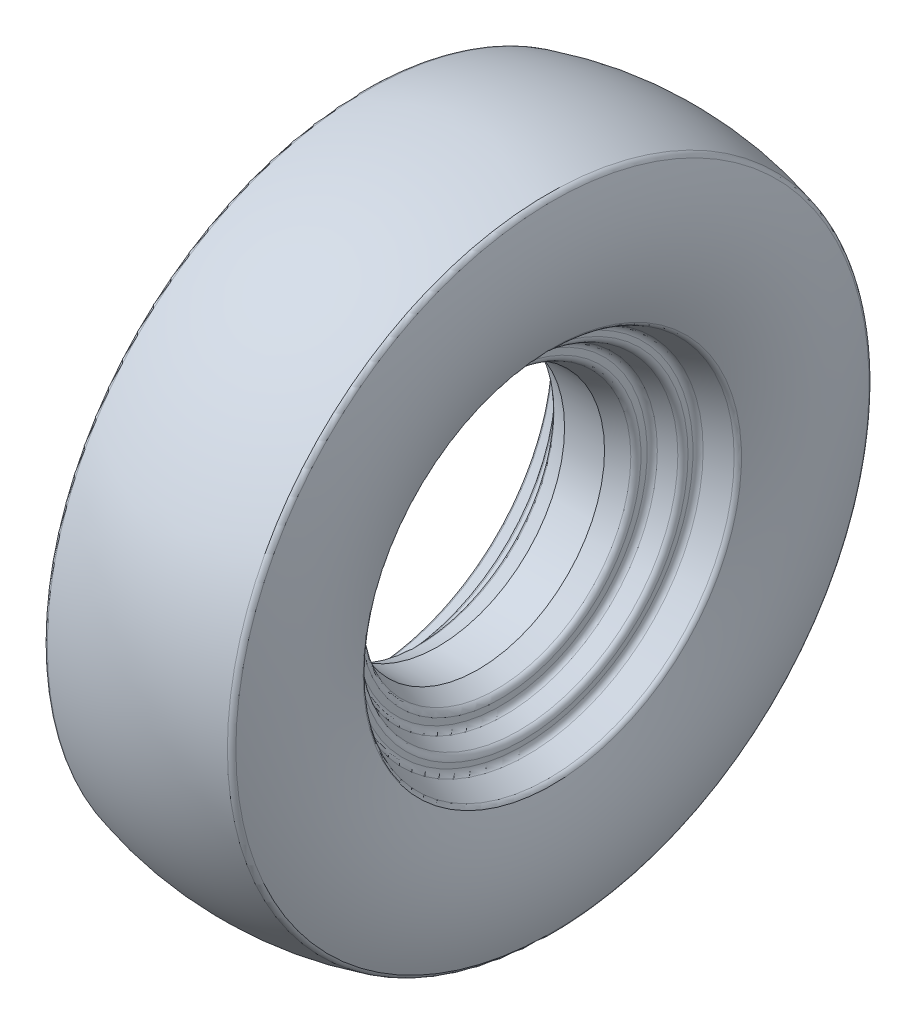
ISO-10303-21;
HEADER;
FILE_DESCRIPTION(('STEP AP214'),'2;1');
FILE_NAME('part.step','',(''),(''),'','','');
FILE_SCHEMA(('AUTOMOTIVE_DESIGN { 1 0 10303 214 1 1 1 1 }'));
ENDSEC;
DATA;
#1=APPLICATION_CONTEXT('core data for automotive mechanical design processes');
#2=APPLICATION_PROTOCOL_DEFINITION('international standard','automotive_design',2000,#1);
#3=PRODUCT_CONTEXT('',#1,'mechanical');
#4=PRODUCT('Part','Part','',(#3));
#5=PRODUCT_RELATED_PRODUCT_CATEGORY('part','',(#4));
#6=PRODUCT_DEFINITION_FORMATION('','',#4);
#7=PRODUCT_DEFINITION_CONTEXT('part definition',#1,'design');
#8=PRODUCT_DEFINITION('design','',#6,#7);
#9=PRODUCT_DEFINITION_SHAPE('','',#8);
#10=(LENGTH_UNIT() NAMED_UNIT(*) SI_UNIT(.MILLI.,.METRE.));
#11=(NAMED_UNIT(*) PLANE_ANGLE_UNIT() SI_UNIT($,.RADIAN.));
#12=(NAMED_UNIT(*) SI_UNIT($,.STERADIAN.) SOLID_ANGLE_UNIT());
#13=UNCERTAINTY_MEASURE_WITH_UNIT(LENGTH_MEASURE(1.E-05),#10,'distance_accuracy_value','');
#14=(GEOMETRIC_REPRESENTATION_CONTEXT(3) GLOBAL_UNCERTAINTY_ASSIGNED_CONTEXT((#13)) GLOBAL_UNIT_ASSIGNED_CONTEXT((#10,
#11,#12)) REPRESENTATION_CONTEXT('',''));
#15=CARTESIAN_POINT('',(0.,0.,0.));
#16=DIRECTION('',(0.,0.,1.));
#17=DIRECTION('',(1.,0.,0.));
#18=AXIS2_PLACEMENT_3D('',#15,#16,#17);
#19=CARTESIAN_POINT('',(0.,0.,0.));
#20=DIRECTION('',(-1.,0.,0.));
#21=DIRECTION('',(0.,0.,-1.));
#22=AXIS2_PLACEMENT_3D('',#19,#20,#21);
#23=SPHERICAL_SURFACE('',#22,250.);
#24=CARTESIAN_POINT('',(67.5948255435348,0.,0.));
#25=DIRECTION('',(-1.,0.,0.));
#26=DIRECTION('',(0.,0.,1.));
#27=AXIS2_PLACEMENT_3D('',#24,#25,#26);
#28=CIRCLE('',#27,240.688469935182);
#29=CARTESIAN_POINT('',(67.5948255435348,0.,-240.688469935182));
#30=VERTEX_POINT('',#29);
#31=EDGE_CURVE('E73',#30,#30,#28,.T.);
#32=CARTESIAN_POINT('',(-67.5948255435348,0.,0.));
#33=DIRECTION('',(-1.,0.,0.));
#34=DIRECTION('',(0.,0.,1.));
#35=AXIS2_PLACEMENT_3D('',#32,#33,#34);
#36=CIRCLE('',#35,240.688469935182);
#37=CARTESIAN_POINT('',(-67.5948255435348,0.,-240.688469935182));
#38=VERTEX_POINT('',#37);
#39=EDGE_CURVE('E252',#38,#38,#36,.T.);
#40=CARTESIAN_POINT('',(67.5948255435348,0.,-240.688469935182));
#41=CARTESIAN_POINT('',(66.2219639795535,0.,-241.074024999859));
#42=CARTESIAN_POINT('',(64.8458030328671,0.,-241.447831637435));
#43=CARTESIAN_POINT('',(62.0872867481365,0.,-242.171844056853));
#44=CARTESIAN_POINT('',(60.7049314100924,0.,-242.522049838696));
#45=CARTESIAN_POINT('',(57.9344307166992,0.,-243.198756545124));
#46=CARTESIAN_POINT('',(56.5462853613501,0.,-243.525257469708));
#47=CARTESIAN_POINT('',(53.7646111887208,0.,-244.154459252569));
#48=CARTESIAN_POINT('',(52.3710823714405,0.,-244.457160110846));
#49=CARTESIAN_POINT('',(49.5790492763945,0.,-245.038673024625));
#50=CARTESIAN_POINT('',(48.1805449986288,0.,-245.317485080127));
#51=CARTESIAN_POINT('',(45.378970475778,0.,-245.851138779535));
#52=CARTESIAN_POINT('',(43.975900230693,0.,-246.10598042344));
#53=CARTESIAN_POINT('',(41.1656045939478,0.,-246.591618673811));
#54=CARTESIAN_POINT('',(39.7583792022877,0.,-246.822415280277));
#55=CARTESIAN_POINT('',(36.9401853122799,0.,-247.259895879923));
#56=CARTESIAN_POINT('',(35.5292168139322,0.,-247.466579873103));
#57=CARTESIAN_POINT('',(32.7039498457569,0.,-247.85577472801));
#58=CARTESIAN_POINT('',(31.2896513759294,0.,-248.038285589738));
#59=CARTESIAN_POINT('',(28.4581385752068,0.,-248.379080742217));
#60=CARTESIAN_POINT('',(27.0409242443117,0.,-248.537365032969));
#61=CARTESIAN_POINT('',(24.2039946855899,0.,-248.829660697394));
#62=CARTESIAN_POINT('',(22.7842794577633,0.,-248.963672071067));
#63=CARTESIAN_POINT('',(19.9427638015965,0.,-249.207382662458));
#64=CARTESIAN_POINT('',(18.5209633732564,0.,-249.317081880174));
#65=CARTESIAN_POINT('',(15.6756936230299,0.,-249.512136039424));
#66=CARTESIAN_POINT('',(14.2522243011435,0.,-249.597490980957));
#67=CARTESIAN_POINT('',(11.4040335594486,0.,-249.743831595685));
#68=CARTESIAN_POINT('',(9.97931213964019,0.,-249.804817268881));
#69=CARTESIAN_POINT('',(7.12903436434326,0.,-249.902401490164));
#70=CARTESIAN_POINT('',(5.70347800885472,0.,-249.939000038253));
#71=CARTESIAN_POINT('',(2.85194776891079,0.,-249.987799293171));
#72=CARTESIAN_POINT('',(1.4259738844554,0.,-250.));
#73=CARTESIAN_POINT('',(-1.42597388445538,0.,-250.));
#74=CARTESIAN_POINT('',(-2.85194776891077,0.,-249.987799293171));
#75=CARTESIAN_POINT('',(-5.70347800885469,0.,-249.939000038253));
#76=CARTESIAN_POINT('',(-7.12903436434323,0.,-249.902401490164));
#77=CARTESIAN_POINT('',(-9.97931213964016,0.,-249.804817268881));
#78=CARTESIAN_POINT('',(-11.4040335594486,0.,-249.743831595685));
#79=CARTESIAN_POINT('',(-14.2522243011434,0.,-249.597490980957));
#80=CARTESIAN_POINT('',(-15.6756936230299,0.,-249.512136039424));
#81=CARTESIAN_POINT('',(-18.5209633732564,0.,-249.317081880174));
#82=CARTESIAN_POINT('',(-19.9427638015965,0.,-249.207382662458));
#83=CARTESIAN_POINT('',(-22.7842794577632,0.,-248.963672071067));
#84=CARTESIAN_POINT('',(-24.2039946855899,0.,-248.829660697394));
#85=CARTESIAN_POINT('',(-27.0409242443117,0.,-248.537365032969));
#86=CARTESIAN_POINT('',(-28.4581385752068,0.,-248.379080742217));
#87=CARTESIAN_POINT('',(-31.2896513759294,0.,-248.038285589738));
#88=CARTESIAN_POINT('',(-32.7039498457569,0.,-247.85577472801));
#89=CARTESIAN_POINT('',(-35.5292168139321,0.,-247.466579873103));
#90=CARTESIAN_POINT('',(-36.9401853122799,0.,-247.259895879923));
#91=CARTESIAN_POINT('',(-39.7583792022877,0.,-246.822415280277));
#92=CARTESIAN_POINT('',(-41.1656045939478,0.,-246.591618673811));
#93=CARTESIAN_POINT('',(-43.975900230693,0.,-246.10598042344));
#94=CARTESIAN_POINT('',(-45.378970475778,0.,-245.851138779535));
#95=CARTESIAN_POINT('',(-48.1805449986288,0.,-245.317485080127));
#96=CARTESIAN_POINT('',(-49.5790492763945,0.,-245.038673024625));
#97=CARTESIAN_POINT('',(-52.3710823714405,0.,-244.457160110846));
#98=CARTESIAN_POINT('',(-53.7646111887207,0.,-244.154459252569));
#99=CARTESIAN_POINT('',(-56.5462853613501,0.,-243.525257469708));
#100=CARTESIAN_POINT('',(-57.9344307166992,0.,-243.198756545124));
#101=CARTESIAN_POINT('',(-60.7049314100924,0.,-242.522049838696));
#102=CARTESIAN_POINT('',(-62.0872867481365,0.,-242.171844056853));
#103=CARTESIAN_POINT('',(-64.845803032867,0.,-241.447831637435));
#104=CARTESIAN_POINT('',(-66.2219639795535,0.,-241.074024999859));
#105=CARTESIAN_POINT('',(-67.5948255435348,0.,-240.688469935182));
#106=B_SPLINE_CURVE_WITH_KNOTS('',3,(#40,#41,#42,#43,#44,#45,#46,#47,#48,#49,#50,#51,#52,#53,
#54,#55,#56,#57,#58,#59,#60,#61,#62,#63,#64,#65,#66,#67,#68,#69,#70,#71,#72,#73,#74,#75,#76,#77,
#78,#79,#80,#81,#82,#83,#84,#85,#86,#87,#88,#89,#90,#91,#92,#93,#94,#95,#96,#97,#98,#99,#100,
#101,#102,#103,#104,#105),.UNSPECIFIED.,.F.,.F.,(4,2,2,2,2,2,2,2,2,2,2,2,2,2,2,2,2,2,2,2,2,2,2,
2,2,2,2,2,2,2,2,2,4),(0.,4.27786946320053,8.55573892640107,12.8336083896016,17.1114778528021,
21.3893473160027,25.6672167792032,29.9450862424037,34.2229557056042,38.5008251688048,
42.7786946320053,47.0565640952058,51.3344335584064,55.6123030216069,59.8901724848074,
64.168041948008,68.4459114112085,72.723780874409,77.0016503376095,81.2795198008101,
85.5573892640106,89.8352587272111,94.1131281904117,98.3909976536122,102.668867116813,
106.946736580013,111.224606043214,115.502475506414,119.780344969615,124.058214432815,
128.336083896016,132.613953359216,136.891822822417),.UNSPECIFIED.);
#107=EDGE_CURVE('BSEAM49',#30,#38,#106,.T.);
#108=ORIENTED_EDGE('',*,*,#31,.T.);
#109=ORIENTED_EDGE('',*,*,#39,.F.);
#110=ORIENTED_EDGE('',*,*,#107,.T.);
#111=ORIENTED_EDGE('',*,*,#107,.F.);
#112=EDGE_LOOP('',(#108,#110,#109,#111));
#113=FACE_BOUND('',#112,.T.);
#114=ADVANCED_FACE('F49',(#113),#23,.T.);
#115=CARTESIAN_POINT('',(70.0399463696018,0.,-140.));
#116=CARTESIAN_POINT('',(89.9800238695371,0.,-190.007667826586));
#117=CARTESIAN_POINT('',(70.,0.,-240.));
#118=B_SPLINE_CURVE_WITH_KNOTS('',2,(#115,#116,#117),.UNSPECIFIED.,.F.,.F.,(3,3),(0.,1.),.UNSPECIFIED.);
#119=CARTESIAN_POINT('',(-111.970451677944,0.,0.));
#120=DIRECTION('',(-1.,0.,0.));
#121=AXIS1_PLACEMENT('',#119,#120);
#122=SURFACE_OF_REVOLUTION('',#118,#121);
#123=CARTESIAN_POINT('',(70.8175545073131,0.,0.));
#124=DIRECTION('',(-1.,0.,0.));
#125=DIRECTION('',(0.,0.,1.));
#126=AXIS2_PLACEMENT_3D('',#123,#124,#125);
#127=CIRCLE('',#126,141.989781455221);
#128=CARTESIAN_POINT('',(70.8175545073131,0.,141.989781455221));
#129=VERTEX_POINT('',#128);
#130=EDGE_CURVE('E81',#129,#129,#127,.T.);
#131=ORIENTED_EDGE('',*,*,#130,.T.);
#132=EDGE_LOOP('',(#131));
#133=FACE_BOUND('',#132,.T.);
#134=CARTESIAN_POINT('',(70.9154064873113,0.,0.));
#135=DIRECTION('',(-1.,0.,0.));
#136=DIRECTION('',(0.,0.,1.));
#137=AXIS2_PLACEMENT_3D('',#134,#135,#136);
#138=CIRCLE('',#137,237.654575373599);
#139=CARTESIAN_POINT('',(70.9154064873113,0.,237.654575373599));
#140=VERTEX_POINT('',#139);
#141=EDGE_CURVE('E85',#140,#140,#138,.F.);
#142=ORIENTED_EDGE('',*,*,#141,.T.);
#143=EDGE_LOOP('',(#142));
#144=FACE_BOUND('',#143,.T.);
#145=ADVANCED_FACE('F119',(#133,#144),#122,.T.);
#146=CARTESIAN_POINT('',(48.7376188481971,0.,0.));
#147=DIRECTION('',(1.,0.,0.));
#148=DIRECTION('',(0.,0.,-1.));
#149=AXIS2_PLACEMENT_3D('',#146,#147,#148);
#150=CONICAL_SURFACE('',#149,130.932753785375,0.402417517667306);
#151=CARTESIAN_POINT('',(51.7793994311506,0.,0.));
#152=DIRECTION('',(1.,0.,0.));
#153=DIRECTION('',(0.,0.,-1.));
#154=AXIS2_PLACEMENT_3D('',#151,#152,#153);
#155=CIRCLE('',#154,132.227474911449);
#156=CARTESIAN_POINT('',(51.7793994311506,0.,-132.227474911449));
#157=VERTEX_POINT('',#156);
#158=EDGE_CURVE('E57',#157,#157,#155,.F.);
#159=ORIENTED_EDGE('',*,*,#158,.T.);
#160=EDGE_LOOP('',(#159));
#161=FACE_BOUND('',#160,.T.);
#162=CARTESIAN_POINT('',(68.1063067556766,0.,0.));
#163=DIRECTION('',(-1.,0.,0.));
#164=DIRECTION('',(0.,0.,1.));
#165=AXIS2_PLACEMENT_3D('',#162,#163,#164);
#166=CIRCLE('',#165,139.176954421896);
#167=CARTESIAN_POINT('',(68.1063067556766,0.,139.176954421896));
#168=VERTEX_POINT('',#167);
#169=EDGE_CURVE('E77',#168,#168,#166,.F.);
#170=ORIENTED_EDGE('',*,*,#169,.T.);
#171=EDGE_LOOP('',(#170));
#172=FACE_BOUND('',#171,.T.);
#173=ADVANCED_FACE('F123',(#161,#172),#150,.F.);
#174=CARTESIAN_POINT('',(48.737618848197,0.,-120.610275725007));
#175=DIRECTION('',(-1.,0.,0.));
#176=DIRECTION('',(0.,0.,1.));
#177=AXIS2_PLACEMENT_3D('',#174,#175,#176);
#178=PLANE('',#177);
#179=CARTESIAN_POINT('',(48.737618848197,0.,0.));
#180=DIRECTION('',(-1.,0.,0.));
#181=DIRECTION('',(0.,0.,1.));
#182=AXIS2_PLACEMENT_3D('',#179,#180,#181);
#183=CIRCLE('',#182,127.626890523058);
#184=CARTESIAN_POINT('',(48.737618848197,0.,127.626890523058));
#185=VERTEX_POINT('',#184);
#186=EDGE_CURVE('E10',#185,#185,#183,.F.);
#187=ORIENTED_EDGE('',*,*,#186,.T.);
#188=EDGE_LOOP('',(#187));
#189=FACE_BOUND('',#188,.T.);
#190=CARTESIAN_POINT('',(48.737618848197,0.,0.));
#191=DIRECTION('',(-1.,0.,0.));
#192=DIRECTION('',(0.,0.,1.));
#193=AXIS2_PLACEMENT_3D('',#190,#191,#192);
#194=CIRCLE('',#193,123.916138987324);
#195=CARTESIAN_POINT('',(48.737618848197,0.,123.916138987324));
#196=VERTEX_POINT('',#195);
#197=EDGE_CURVE('E93',#196,#196,#194,.T.);
#198=ORIENTED_EDGE('',*,*,#197,.T.);
#199=EDGE_LOOP('',(#198));
#200=FACE_BOUND('',#199,.T.);
#201=ADVANCED_FACE('F161',(#189,#200),#178,.F.);
#202=CARTESIAN_POINT('',(31.8688094240985,0.,0.));
#203=DIRECTION('',(1.,0.,0.));
#204=DIRECTION('',(0.,0.,-1.));
#205=AXIS2_PLACEMENT_3D('',#202,#203,#204);
#206=CONICAL_SURFACE('',#205,113.430137862503,0.402417517667305);
#207=CARTESIAN_POINT('',(34.9105900070521,0.,0.));
#208=DIRECTION('',(1.,0.,0.));
#209=DIRECTION('',(0.,0.,-1.));
#210=AXIS2_PLACEMENT_3D('',#207,#208,#209);
#211=CIRCLE('',#210,114.724858988577);
#212=CARTESIAN_POINT('',(34.9105900070521,0.,-114.724858988577));
#213=VERTEX_POINT('',#212);
#214=EDGE_CURVE('E67',#213,#213,#211,.F.);
#215=ORIENTED_EDGE('',*,*,#214,.T.);
#216=EDGE_LOOP('',(#215));
#217=FACE_BOUND('',#216,.T.);
#218=CARTESIAN_POINT('',(45.6958382652435,0.,0.));
#219=DIRECTION('',(-1.,0.,0.));
#220=DIRECTION('',(0.,0.,1.));
#221=AXIS2_PLACEMENT_3D('',#218,#219,#220);
#222=CIRCLE('',#221,119.315554598933);
#223=CARTESIAN_POINT('',(45.6958382652435,0.,119.315554598933));
#224=VERTEX_POINT('',#223);
#225=EDGE_CURVE('E89',#224,#224,#222,.F.);
#226=ORIENTED_EDGE('',*,*,#225,.T.);
#227=EDGE_LOOP('',(#226));
#228=FACE_BOUND('',#227,.T.);
#229=ADVANCED_FACE('F157',(#217,#228),#206,.F.);
#230=CARTESIAN_POINT('',(31.8688094240985,0.,-102.180137862503));
#231=DIRECTION('',(-1.,0.,0.));
#232=DIRECTION('',(0.,0.,1.));
#233=AXIS2_PLACEMENT_3D('',#230,#231,#232);
#234=PLANE('',#233);
#235=CARTESIAN_POINT('',(31.8688094240985,0.,0.));
#236=DIRECTION('',(-1.,0.,0.));
#237=DIRECTION('',(0.,0.,1.));
#238=AXIS2_PLACEMENT_3D('',#235,#236,#237);
#239=CIRCLE('',#238,110.124274600187);
#240=CARTESIAN_POINT('',(31.8688094240985,0.,110.124274600187));
#241=VERTEX_POINT('',#240);
#242=EDGE_CURVE('E62',#241,#241,#239,.F.);
#243=ORIENTED_EDGE('',*,*,#242,.T.);
#244=EDGE_LOOP('',(#243));
#245=FACE_BOUND('',#244,.T.);
#246=CARTESIAN_POINT('',(31.8688094240985,0.,0.));
#247=DIRECTION('',(-1.,0.,0.));
#248=DIRECTION('',(0.,0.,1.));
#249=AXIS2_PLACEMENT_3D('',#246,#247,#248);
#250=CIRCLE('',#249,105.48600112482);
#251=CARTESIAN_POINT('',(31.8688094240985,0.,105.48600112482));
#252=VERTEX_POINT('',#251);
#253=EDGE_CURVE('E101',#252,#252,#250,.T.);
#254=ORIENTED_EDGE('',*,*,#253,.T.);
#255=EDGE_LOOP('',(#254));
#256=FACE_BOUND('',#255,.T.);
#257=ADVANCED_FACE('F160',(#245,#256),#234,.F.);
#258=CARTESIAN_POINT('',(15.,0.,0.));
#259=DIRECTION('',(1.,0.,0.));
#260=DIRECTION('',(0.,0.,-1.));
#261=AXIS2_PLACEMENT_3D('',#258,#259,#260);
#262=CONICAL_SURFACE('',#261,95.,0.402417517667305);
#263=CARTESIAN_POINT('',(28.8270288411449,0.,0.));
#264=DIRECTION('',(-1.,0.,0.));
#265=DIRECTION('',(0.,0.,1.));
#266=AXIS2_PLACEMENT_3D('',#263,#264,#265);
#267=CIRCLE('',#266,100.88541673643);
#268=CARTESIAN_POINT('',(28.8270288411449,0.,100.88541673643));
#269=VERTEX_POINT('',#268);
#270=EDGE_CURVE('E97',#269,#269,#267,.F.);
#271=ORIENTED_EDGE('',*,*,#270,.T.);
#272=EDGE_LOOP('',(#271));
#273=FACE_BOUND('',#272,.T.);
#274=CARTESIAN_POINT('',(15.,0.,0.));
#275=DIRECTION('',(-1.,0.,0.));
#276=DIRECTION('',(0.,0.,1.));
#277=AXIS2_PLACEMENT_3D('',#274,#275,#276);
#278=CIRCLE('',#277,95.);
#279=CARTESIAN_POINT('',(15.,0.,95.));
#280=VERTEX_POINT('',#279);
#281=EDGE_CURVE('E105',#280,#280,#278,.T.);
#282=ORIENTED_EDGE('',*,*,#281,.T.);
#283=EDGE_LOOP('',(#282));
#284=FACE_BOUND('',#283,.T.);
#285=ADVANCED_FACE('F174',(#273,#284),#262,.F.);
#286=CARTESIAN_POINT('',(-111.970451677944,0.,0.));
#287=DIRECTION('',(-1.,0.,0.));
#288=DIRECTION('',(0.,0.,1.));
#289=AXIS2_PLACEMENT_3D('',#286,#287,#288);
#290=CYLINDRICAL_SURFACE('',#289,95.);
#291=ORIENTED_EDGE('',*,*,#281,.F.);
#292=EDGE_LOOP('',(#291));
#293=FACE_BOUND('',#292,.T.);
#294=CARTESIAN_POINT('',(-15.,0.,0.));
#295=DIRECTION('',(-1.,0.,0.));
#296=DIRECTION('',(0.,0.,1.));
#297=AXIS2_PLACEMENT_3D('',#294,#295,#296);
#298=CIRCLE('',#297,95.);
#299=CARTESIAN_POINT('',(-15.,0.,95.));
#300=VERTEX_POINT('',#299);
#301=EDGE_CURVE('E217',#300,#300,#298,.T.);
#302=ORIENTED_EDGE('',*,*,#301,.T.);
#303=EDGE_LOOP('',(#302));
#304=FACE_BOUND('',#303,.T.);
#305=ADVANCED_FACE('F133',(#293,#304),#290,.F.);
#306=CARTESIAN_POINT('',(26.8688094240985,0.,0.));
#307=DIRECTION('',(-1.,0.,0.));
#308=DIRECTION('',(0.,0.,1.));
#309=AXIS2_PLACEMENT_3D('',#306,#307,#308);
#310=TOROIDAL_SURFACE('',#309,105.48600112482,5.);
#311=ORIENTED_EDGE('',*,*,#270,.F.);
#312=EDGE_LOOP('',(#311));
#313=FACE_BOUND('',#312,.T.);
#314=ORIENTED_EDGE('',*,*,#253,.F.);
#315=EDGE_LOOP('',(#314));
#316=FACE_BOUND('',#315,.T.);
#317=ADVANCED_FACE('F129',(#313,#316),#310,.T.);
#318=CARTESIAN_POINT('',(43.737618848197,0.,0.));
#319=DIRECTION('',(-1.,0.,0.));
#320=DIRECTION('',(0.,0.,1.));
#321=AXIS2_PLACEMENT_3D('',#318,#319,#320);
#322=TOROIDAL_SURFACE('',#321,123.916138987324,5.);
#323=ORIENTED_EDGE('',*,*,#225,.F.);
#324=EDGE_LOOP('',(#323));
#325=FACE_BOUND('',#324,.T.);
#326=ORIENTED_EDGE('',*,*,#197,.F.);
#327=EDGE_LOOP('',(#326));
#328=FACE_BOUND('',#327,.T.);
#329=ADVANCED_FACE('F132',(#325,#328),#322,.T.);
#330=CARTESIAN_POINT('',(66.1480873386302,0.,0.));
#331=DIRECTION('',(1.,0.,0.));
#332=DIRECTION('',(0.,0.,-1.));
#333=AXIS2_PLACEMENT_3D('',#330,#331,#332);
#334=TOROIDAL_SURFACE('',#333,143.777538810287,5.);
#335=ORIENTED_EDGE('',*,*,#169,.F.);
#336=EDGE_LOOP('',(#335));
#337=FACE_BOUND('',#336,.T.);
#338=ORIENTED_EDGE('',*,*,#130,.F.);
#339=EDGE_LOOP('',(#338));
#340=FACE_BOUND('',#339,.T.);
#341=ADVANCED_FACE('F137',(#337,#340),#334,.T.);
#342=CARTESIAN_POINT('',(66.2429290326641,0.,0.));
#343=DIRECTION('',(-1.,0.,0.));
#344=DIRECTION('',(0.,0.,1.));
#345=AXIS2_PLACEMENT_3D('',#342,#343,#344);
#346=TOROIDAL_SURFACE('',#345,235.874700536479,5.);
#347=ORIENTED_EDGE('',*,*,#141,.F.);
#348=EDGE_LOOP('',(#347));
#349=FACE_BOUND('',#348,.T.);
#350=ORIENTED_EDGE('',*,*,#31,.F.);
#351=EDGE_LOOP('',(#350));
#352=FACE_BOUND('',#351,.T.);
#353=ADVANCED_FACE('F141',(#349,#352),#346,.T.);
#354=CARTESIAN_POINT('',(36.8688094240985,0.,0.));
#355=DIRECTION('',(-1.,0.,0.));
#356=DIRECTION('',(0.,0.,1.));
#357=AXIS2_PLACEMENT_3D('',#354,#355,#356);
#358=TOROIDAL_SURFACE('',#357,110.124274600187,5.);
#359=ORIENTED_EDGE('',*,*,#242,.F.);
#360=EDGE_LOOP('',(#359));
#361=FACE_BOUND('',#360,.T.);
#362=ORIENTED_EDGE('',*,*,#214,.F.);
#363=EDGE_LOOP('',(#362));
#364=FACE_BOUND('',#363,.T.);
#365=ADVANCED_FACE('F144',(#361,#364),#358,.F.);
#366=CARTESIAN_POINT('',(53.737618848197,0.,0.));
#367=DIRECTION('',(-1.,0.,0.));
#368=DIRECTION('',(0.,0.,1.));
#369=AXIS2_PLACEMENT_3D('',#366,#367,#368);
#370=TOROIDAL_SURFACE('',#369,127.626890523058,5.);
#371=ORIENTED_EDGE('',*,*,#186,.F.);
#372=EDGE_LOOP('',(#371));
#373=FACE_BOUND('',#372,.T.);
#374=ORIENTED_EDGE('',*,*,#158,.F.);
#375=EDGE_LOOP('',(#374));
#376=FACE_BOUND('',#375,.T.);
#377=ADVANCED_FACE('F51',(#373,#376),#370,.F.);
#378=CARTESIAN_POINT('',(-70.0399463696018,0.,-140.));
#379=CARTESIAN_POINT('',(-89.9800238695371,0.,-190.007667826586));
#380=CARTESIAN_POINT('',(-70.,0.,-240.));
#381=B_SPLINE_CURVE_WITH_KNOTS('',2,(#378,#379,#380),.UNSPECIFIED.,.F.,.F.,(3,3),(0.,1.),.UNSPECIFIED.);
#382=CARTESIAN_POINT('',(111.970451677944,0.,0.));
#383=DIRECTION('',(1.,0.,0.));
#384=AXIS1_PLACEMENT('',#382,#383);
#385=SURFACE_OF_REVOLUTION('',#381,#384);
#386=CARTESIAN_POINT('',(-70.8175545073131,0.,0.));
#387=DIRECTION('',(-1.,0.,0.));
#388=DIRECTION('',(0.,0.,1.));
#389=AXIS2_PLACEMENT_3D('',#386,#387,#388);
#390=CIRCLE('',#389,141.989781455221);
#391=CARTESIAN_POINT('',(-70.8175545073131,0.,141.989781455221));
#392=VERTEX_POINT('',#391);
#393=EDGE_CURVE('E244',#392,#392,#390,.T.);
#394=ORIENTED_EDGE('',*,*,#393,.F.);
#395=EDGE_LOOP('',(#394));
#396=FACE_BOUND('',#395,.T.);
#397=CARTESIAN_POINT('',(-70.9154064873113,0.,0.));
#398=DIRECTION('',(-1.,0.,0.));
#399=DIRECTION('',(0.,0.,1.));
#400=AXIS2_PLACEMENT_3D('',#397,#398,#399);
#401=CIRCLE('',#400,237.654575373599);
#402=CARTESIAN_POINT('',(-70.9154064873113,0.,237.654575373599));
#403=VERTEX_POINT('',#402);
#404=EDGE_CURVE('E240',#403,#403,#401,.F.);
#405=ORIENTED_EDGE('',*,*,#404,.F.);
#406=EDGE_LOOP('',(#405));
#407=FACE_BOUND('',#406,.T.);
#408=ADVANCED_FACE('F151',(#396,#407),#385,.T.);
#409=CARTESIAN_POINT('',(-48.7376188481971,0.,0.));
#410=DIRECTION('',(-1.,0.,0.));
#411=DIRECTION('',(0.,0.,-1.));
#412=AXIS2_PLACEMENT_3D('',#409,#410,#411);
#413=CONICAL_SURFACE('',#412,130.932753785375,0.402417517667306);
#414=CARTESIAN_POINT('',(-51.7793994311506,0.,0.));
#415=DIRECTION('',(1.,0.,0.));
#416=DIRECTION('',(0.,0.,-1.));
#417=AXIS2_PLACEMENT_3D('',#414,#415,#416);
#418=CIRCLE('',#417,132.227474911449);
#419=CARTESIAN_POINT('',(-51.7793994311506,0.,-132.227474911449));
#420=VERTEX_POINT('',#419);
#421=EDGE_CURVE('E263',#420,#420,#418,.F.);
#422=ORIENTED_EDGE('',*,*,#421,.F.);
#423=EDGE_LOOP('',(#422));
#424=FACE_BOUND('',#423,.T.);
#425=CARTESIAN_POINT('',(-68.1063067556766,0.,0.));
#426=DIRECTION('',(-1.,0.,0.));
#427=DIRECTION('',(0.,0.,1.));
#428=AXIS2_PLACEMENT_3D('',#425,#426,#427);
#429=CIRCLE('',#428,139.176954421896);
#430=CARTESIAN_POINT('',(-68.1063067556766,0.,139.176954421896));
#431=VERTEX_POINT('',#430);
#432=EDGE_CURVE('E248',#431,#431,#429,.F.);
#433=ORIENTED_EDGE('',*,*,#432,.F.);
#434=EDGE_LOOP('',(#433));
#435=FACE_BOUND('',#434,.T.);
#436=ADVANCED_FACE('F210',(#424,#435),#413,.F.);
#437=CARTESIAN_POINT('',(-48.737618848197,0.,-120.610275725007));
#438=DIRECTION('',(1.,0.,0.));
#439=DIRECTION('',(0.,0.,1.));
#440=AXIS2_PLACEMENT_3D('',#437,#438,#439);
#441=PLANE('',#440);
#442=CARTESIAN_POINT('',(-48.737618848197,0.,0.));
#443=DIRECTION('',(-1.,0.,0.));
#444=DIRECTION('',(0.,0.,1.));
#445=AXIS2_PLACEMENT_3D('',#442,#443,#444);
#446=CIRCLE('',#445,127.626890523058);
#447=CARTESIAN_POINT('',(-48.737618848197,0.,127.626890523058));
#448=VERTEX_POINT('',#447);
#449=EDGE_CURVE('E109',#448,#448,#446,.F.);
#450=ORIENTED_EDGE('',*,*,#449,.F.);
#451=EDGE_LOOP('',(#450));
#452=FACE_BOUND('',#451,.T.);
#453=CARTESIAN_POINT('',(-48.737618848197,0.,0.));
#454=DIRECTION('',(-1.,0.,0.));
#455=DIRECTION('',(0.,0.,1.));
#456=AXIS2_PLACEMENT_3D('',#453,#454,#455);
#457=CIRCLE('',#456,123.916138987324);
#458=CARTESIAN_POINT('',(-48.737618848197,0.,123.916138987324));
#459=VERTEX_POINT('',#458);
#460=EDGE_CURVE('E232',#459,#459,#457,.T.);
#461=ORIENTED_EDGE('',*,*,#460,.F.);
#462=EDGE_LOOP('',(#461));
#463=FACE_BOUND('',#462,.T.);
#464=ADVANCED_FACE('F272',(#452,#463),#441,.F.);
#465=CARTESIAN_POINT('',(-31.8688094240985,0.,0.));
#466=DIRECTION('',(-1.,0.,0.));
#467=DIRECTION('',(0.,0.,-1.));
#468=AXIS2_PLACEMENT_3D('',#465,#466,#467);
#469=CONICAL_SURFACE('',#468,113.430137862503,0.402417517667305);
#470=CARTESIAN_POINT('',(-34.9105900070521,0.,0.));
#471=DIRECTION('',(1.,0.,0.));
#472=DIRECTION('',(0.,0.,-1.));
#473=AXIS2_PLACEMENT_3D('',#470,#471,#472);
#474=CIRCLE('',#473,114.724858988577);
#475=CARTESIAN_POINT('',(-34.9105900070521,0.,-114.724858988577));
#476=VERTEX_POINT('',#475);
#477=EDGE_CURVE('E256',#476,#476,#474,.F.);
#478=ORIENTED_EDGE('',*,*,#477,.F.);
#479=EDGE_LOOP('',(#478));
#480=FACE_BOUND('',#479,.T.);
#481=CARTESIAN_POINT('',(-45.6958382652435,0.,0.));
#482=DIRECTION('',(-1.,0.,0.));
#483=DIRECTION('',(0.,0.,1.));
#484=AXIS2_PLACEMENT_3D('',#481,#482,#483);
#485=CIRCLE('',#484,119.315554598933);
#486=CARTESIAN_POINT('',(-45.6958382652435,0.,119.315554598933));
#487=VERTEX_POINT('',#486);
#488=EDGE_CURVE('E236',#487,#487,#485,.F.);
#489=ORIENTED_EDGE('',*,*,#488,.F.);
#490=EDGE_LOOP('',(#489));
#491=FACE_BOUND('',#490,.T.);
#492=ADVANCED_FACE('F275',(#480,#491),#469,.F.);
#493=CARTESIAN_POINT('',(-31.8688094240985,0.,-102.180137862503));
#494=DIRECTION('',(1.,0.,0.));
#495=DIRECTION('',(0.,0.,1.));
#496=AXIS2_PLACEMENT_3D('',#493,#494,#495);
#497=PLANE('',#496);
#498=CARTESIAN_POINT('',(-31.8688094240985,0.,0.));
#499=DIRECTION('',(-1.,0.,0.));
#500=DIRECTION('',(0.,0.,1.));
#501=AXIS2_PLACEMENT_3D('',#498,#499,#500);
#502=CIRCLE('',#501,110.124274600187);
#503=CARTESIAN_POINT('',(-31.8688094240985,0.,110.124274600187));
#504=VERTEX_POINT('',#503);
#505=EDGE_CURVE('E260',#504,#504,#502,.F.);
#506=ORIENTED_EDGE('',*,*,#505,.F.);
#507=EDGE_LOOP('',(#506));
#508=FACE_BOUND('',#507,.T.);
#509=CARTESIAN_POINT('',(-31.8688094240985,0.,0.));
#510=DIRECTION('',(-1.,0.,0.));
#511=DIRECTION('',(0.,0.,1.));
#512=AXIS2_PLACEMENT_3D('',#509,#510,#511);
#513=CIRCLE('',#512,105.48600112482);
#514=CARTESIAN_POINT('',(-31.8688094240985,0.,105.48600112482));
#515=VERTEX_POINT('',#514);
#516=EDGE_CURVE('E224',#515,#515,#513,.T.);
#517=ORIENTED_EDGE('',*,*,#516,.F.);
#518=EDGE_LOOP('',(#517));
#519=FACE_BOUND('',#518,.T.);
#520=ADVANCED_FACE('F282',(#508,#519),#497,.F.);
#521=CARTESIAN_POINT('',(-15.,0.,0.));
#522=DIRECTION('',(-1.,0.,0.));
#523=DIRECTION('',(0.,0.,-1.));
#524=AXIS2_PLACEMENT_3D('',#521,#522,#523);
#525=CONICAL_SURFACE('',#524,95.,0.402417517667305);
#526=CARTESIAN_POINT('',(-28.8270288411449,0.,0.));
#527=DIRECTION('',(-1.,0.,0.));
#528=DIRECTION('',(0.,0.,1.));
#529=AXIS2_PLACEMENT_3D('',#526,#527,#528);
#530=CIRCLE('',#529,100.88541673643);
#531=CARTESIAN_POINT('',(-28.8270288411449,0.,100.88541673643));
#532=VERTEX_POINT('',#531);
#533=EDGE_CURVE('E228',#532,#532,#530,.F.);
#534=ORIENTED_EDGE('',*,*,#533,.F.);
#535=EDGE_LOOP('',(#534));
#536=FACE_BOUND('',#535,.T.);
#537=ORIENTED_EDGE('',*,*,#301,.F.);
#538=EDGE_LOOP('',(#537));
#539=FACE_BOUND('',#538,.T.);
#540=ADVANCED_FACE('F205',(#536,#539),#525,.F.);
#541=CARTESIAN_POINT('',(-26.8688094240985,0.,0.));
#542=DIRECTION('',(1.,0.,0.));
#543=DIRECTION('',(0.,0.,1.));
#544=AXIS2_PLACEMENT_3D('',#541,#542,#543);
#545=TOROIDAL_SURFACE('',#544,105.48600112482,5.);
#546=ORIENTED_EDGE('',*,*,#533,.T.);
#547=EDGE_LOOP('',(#546));
#548=FACE_BOUND('',#547,.T.);
#549=ORIENTED_EDGE('',*,*,#516,.T.);
#550=EDGE_LOOP('',(#549));
#551=FACE_BOUND('',#550,.T.);
#552=ADVANCED_FACE('F201',(#548,#551),#545,.T.);
#553=CARTESIAN_POINT('',(-43.737618848197,0.,0.));
#554=DIRECTION('',(1.,0.,0.));
#555=DIRECTION('',(0.,0.,1.));
#556=AXIS2_PLACEMENT_3D('',#553,#554,#555);
#557=TOROIDAL_SURFACE('',#556,123.916138987324,5.);
#558=ORIENTED_EDGE('',*,*,#488,.T.);
#559=EDGE_LOOP('',(#558));
#560=FACE_BOUND('',#559,.T.);
#561=ORIENTED_EDGE('',*,*,#460,.T.);
#562=EDGE_LOOP('',(#561));
#563=FACE_BOUND('',#562,.T.);
#564=ADVANCED_FACE('F197',(#560,#563),#557,.T.);
#565=CARTESIAN_POINT('',(-66.1480873386302,0.,0.));
#566=DIRECTION('',(-1.,0.,0.));
#567=DIRECTION('',(0.,0.,-1.));
#568=AXIS2_PLACEMENT_3D('',#565,#566,#567);
#569=TOROIDAL_SURFACE('',#568,143.777538810287,5.);
#570=ORIENTED_EDGE('',*,*,#432,.T.);
#571=EDGE_LOOP('',(#570));
#572=FACE_BOUND('',#571,.T.);
#573=ORIENTED_EDGE('',*,*,#393,.T.);
#574=EDGE_LOOP('',(#573));
#575=FACE_BOUND('',#574,.T.);
#576=ADVANCED_FACE('F193',(#572,#575),#569,.T.);
#577=CARTESIAN_POINT('',(-66.2429290326641,0.,0.));
#578=DIRECTION('',(1.,0.,0.));
#579=DIRECTION('',(0.,0.,1.));
#580=AXIS2_PLACEMENT_3D('',#577,#578,#579);
#581=TOROIDAL_SURFACE('',#580,235.874700536479,5.);
#582=ORIENTED_EDGE('',*,*,#404,.T.);
#583=EDGE_LOOP('',(#582));
#584=FACE_BOUND('',#583,.T.);
#585=ORIENTED_EDGE('',*,*,#39,.T.);
#586=EDGE_LOOP('',(#585));
#587=FACE_BOUND('',#586,.T.);
#588=ADVANCED_FACE('F189',(#584,#587),#581,.T.);
#589=CARTESIAN_POINT('',(-36.8688094240985,0.,0.));
#590=DIRECTION('',(1.,0.,0.));
#591=DIRECTION('',(0.,0.,1.));
#592=AXIS2_PLACEMENT_3D('',#589,#590,#591);
#593=TOROIDAL_SURFACE('',#592,110.124274600187,5.);
#594=ORIENTED_EDGE('',*,*,#505,.T.);
#595=EDGE_LOOP('',(#594));
#596=FACE_BOUND('',#595,.T.);
#597=ORIENTED_EDGE('',*,*,#477,.T.);
#598=EDGE_LOOP('',(#597));
#599=FACE_BOUND('',#598,.T.);
#600=ADVANCED_FACE('F185',(#596,#599),#593,.F.);
#601=CARTESIAN_POINT('',(-53.737618848197,0.,0.));
#602=DIRECTION('',(1.,0.,0.));
#603=DIRECTION('',(0.,0.,1.));
#604=AXIS2_PLACEMENT_3D('',#601,#602,#603);
#605=TOROIDAL_SURFACE('',#604,127.626890523058,5.);
#606=ORIENTED_EDGE('',*,*,#449,.T.);
#607=EDGE_LOOP('',(#606));
#608=FACE_BOUND('',#607,.T.);
#609=ORIENTED_EDGE('',*,*,#421,.T.);
#610=EDGE_LOOP('',(#609));
#611=FACE_BOUND('',#610,.T.);
#612=ADVANCED_FACE('F182',(#608,#611),#605,.F.);
#613=CLOSED_SHELL('',(#114,#145,#173,#201,#229,#257,#285,#305,#317,#329,#341,#353,#365,#377,
#408,#436,#464,#492,#520,#540,#552,#564,#576,#588,#600,#612));
#614=MANIFOLD_SOLID_BREP('B2',#613);
#615=ADVANCED_BREP_SHAPE_REPRESENTATION('',(#18,#614),#14);
#616=SHAPE_DEFINITION_REPRESENTATION(#9,#615);
ENDSEC;
END-ISO-10303-21;
